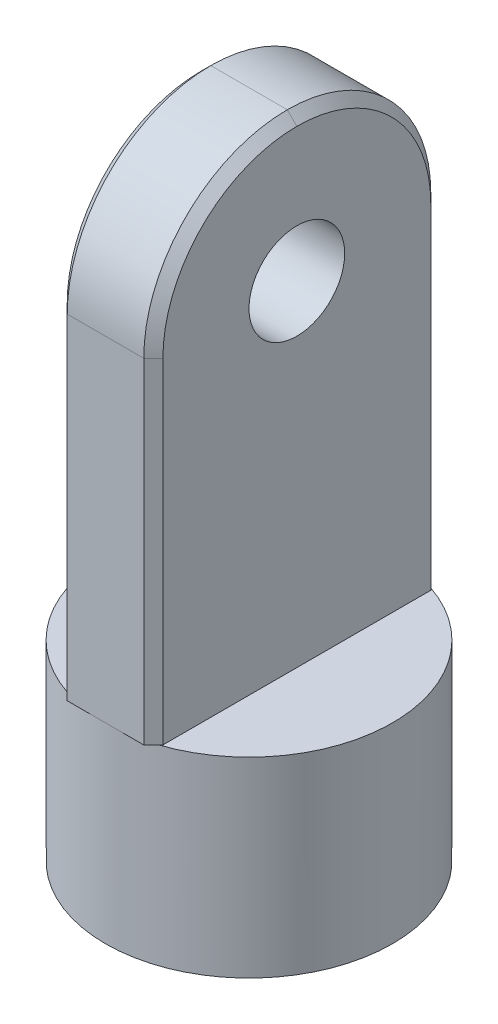
ISO-10303-21;
HEADER;
FILE_DESCRIPTION(('STEP AP214'),'2;1');
FILE_NAME('part.step','',(''),(''),'','','');
FILE_SCHEMA(('AUTOMOTIVE_DESIGN { 1 0 10303 214 1 1 1 1 }'));
ENDSEC;
DATA;
#1=APPLICATION_CONTEXT('core data for automotive mechanical design processes');
#2=APPLICATION_PROTOCOL_DEFINITION('international standard','automotive_design',2000,#1);
#3=PRODUCT_CONTEXT('',#1,'mechanical');
#4=PRODUCT('Part','Part','',(#3));
#5=PRODUCT_RELATED_PRODUCT_CATEGORY('part','',(#4));
#6=PRODUCT_DEFINITION_FORMATION('','',#4);
#7=PRODUCT_DEFINITION_CONTEXT('part definition',#1,'design');
#8=PRODUCT_DEFINITION('design','',#6,#7);
#9=PRODUCT_DEFINITION_SHAPE('','',#8);
#10=(LENGTH_UNIT() NAMED_UNIT(*) SI_UNIT(.MILLI.,.METRE.));
#11=(NAMED_UNIT(*) PLANE_ANGLE_UNIT() SI_UNIT($,.RADIAN.));
#12=(NAMED_UNIT(*) SI_UNIT($,.STERADIAN.) SOLID_ANGLE_UNIT());
#13=UNCERTAINTY_MEASURE_WITH_UNIT(LENGTH_MEASURE(1.E-05),#10,'distance_accuracy_value','');
#14=(GEOMETRIC_REPRESENTATION_CONTEXT(3) GLOBAL_UNCERTAINTY_ASSIGNED_CONTEXT((#13)) GLOBAL_UNIT_ASSIGNED_CONTEXT((#10,
#11,#12)) REPRESENTATION_CONTEXT('',''));
#15=CARTESIAN_POINT('',(0.,0.,0.));
#16=DIRECTION('',(0.,0.,1.));
#17=DIRECTION('',(1.,0.,0.));
#18=AXIS2_PLACEMENT_3D('',#15,#16,#17);
#19=CARTESIAN_POINT('',(0.,10.,0.));
#20=DIRECTION('',(0.,1.,0.));
#21=DIRECTION('',(0.,0.,1.));
#22=AXIS2_PLACEMENT_3D('',#19,#20,#21);
#23=PLANE('',#22);
#24=DIRECTION('',(0.,0.,-1.));
#25=VECTOR('',#24,1.);
#26=CARTESIAN_POINT('',(2.5,10.,7.5));
#27=LINE('',#26,#25);
#28=CARTESIAN_POINT('',(2.5,10.,7.));
#29=VERTEX_POINT('',#28);
#30=CARTESIAN_POINT('',(2.5,10.,-7.));
#31=VERTEX_POINT('',#30);
#32=EDGE_CURVE('E177',#29,#31,#27,.T.);
#33=ORIENTED_EDGE('',*,*,#32,.F.);
#34=DIRECTION('',(0.70710678118655,0.,-0.707106781186545));
#35=VECTOR('',#34,1.);
#36=CARTESIAN_POINT('',(2.5,10.,7.));
#37=LINE('',#36,#35);
#38=CARTESIAN_POINT('',(2.39150471698585,10.,7.10849528301415));
#39=VERTEX_POINT('',#38);
#40=EDGE_CURVE('E226',#29,#39,#37,.F.);
#41=ORIENTED_EDGE('',*,*,#40,.T.);
#42=CARTESIAN_POINT('',(0.,10.,0.));
#43=DIRECTION('',(0.,1.,0.));
#44=DIRECTION('',(0.,0.,1.));
#45=AXIS2_PLACEMENT_3D('',#42,#43,#44);
#46=CIRCLE('',#45,7.5);
#47=CARTESIAN_POINT('',(2.39150471698585,10.,-7.10849528301415));
#48=VERTEX_POINT('',#47);
#49=EDGE_CURVE('E153',#39,#48,#46,.T.);
#50=ORIENTED_EDGE('',*,*,#49,.T.);
#51=DIRECTION('',(-0.707106781186549,0.,-0.707106781186546));
#52=VECTOR('',#51,1.);
#53=CARTESIAN_POINT('',(2.,10.,-7.5));
#54=LINE('',#53,#52);
#55=EDGE_CURVE('E224',#48,#31,#54,.F.);
#56=ORIENTED_EDGE('',*,*,#55,.T.);
#57=EDGE_LOOP('',(#33,#41,#50,#56));
#58=FACE_BOUND('',#57,.T.);
#59=ADVANCED_FACE('F33',(#58),#23,.T.);
#60=CARTESIAN_POINT('',(0.,10.,0.));
#61=DIRECTION('',(0.,-1.,0.));
#62=DIRECTION('',(0.,0.,-1.));
#63=AXIS2_PLACEMENT_3D('',#60,#61,#62);
#64=CYLINDRICAL_SURFACE('',#63,7.5);
#65=CARTESIAN_POINT('',(0.,10.,7.5));
#66=VERTEX_POINT('',#65);
#67=EDGE_CURVE('E137',#66,#39,#46,.T.);
#68=ORIENTED_EDGE('',*,*,#67,.F.);
#69=CARTESIAN_POINT('',(-2.39150471698584,10.,7.10849528301415));
#70=VERTEX_POINT('',#69);
#71=EDGE_CURVE('E126',#70,#66,#46,.T.);
#72=ORIENTED_EDGE('',*,*,#71,.F.);
#73=CARTESIAN_POINT('',(-2.39150471698583,10.,-7.10849528301416));
#74=VERTEX_POINT('',#73);
#75=EDGE_CURVE('E51',#74,#70,#46,.T.);
#76=ORIENTED_EDGE('',*,*,#75,.F.);
#77=CARTESIAN_POINT('',(0.,10.,-7.5));
#78=VERTEX_POINT('',#77);
#79=EDGE_CURVE('E308',#78,#74,#46,.T.);
#80=ORIENTED_EDGE('',*,*,#79,.F.);
#81=EDGE_CURVE('E136',#48,#78,#46,.T.);
#82=ORIENTED_EDGE('',*,*,#81,.F.);
#83=ORIENTED_EDGE('',*,*,#49,.F.);
#84=EDGE_LOOP('',(#68,#72,#76,#80,#82,#83));
#85=FACE_BOUND('',#84,.T.);
#86=CARTESIAN_POINT('',(0.,0.,0.));
#87=DIRECTION('',(0.,1.,0.));
#88=DIRECTION('',(0.,0.,1.));
#89=AXIS2_PLACEMENT_3D('',#86,#87,#88);
#90=CIRCLE('',#89,7.5);
#91=CARTESIAN_POINT('',(0.,0.,7.5));
#92=VERTEX_POINT('',#91);
#93=EDGE_CURVE('E134',#92,#92,#90,.T.);
#94=ORIENTED_EDGE('',*,*,#93,.T.);
#95=EDGE_LOOP('',(#94));
#96=FACE_BOUND('',#95,.T.);
#97=ADVANCED_FACE('F150',(#85,#96),#64,.T.);
#98=DIRECTION('',(0.,0.,1.));
#99=VECTOR('',#98,1.);
#100=CARTESIAN_POINT('',(-2.5,10.,7.5));
#101=LINE('',#100,#99);
#102=CARTESIAN_POINT('',(-2.5,10.,-6.99999999999999));
#103=VERTEX_POINT('',#102);
#104=CARTESIAN_POINT('',(-2.5,10.,6.99999999999999));
#105=VERTEX_POINT('',#104);
#106=EDGE_CURVE('E156',#103,#105,#101,.T.);
#107=ORIENTED_EDGE('',*,*,#106,.F.);
#108=DIRECTION('',(-0.707106781186544,0.,0.707106781186551));
#109=VECTOR('',#108,1.);
#110=CARTESIAN_POINT('',(-2.5,10.,-6.99999999999999));
#111=LINE('',#110,#109);
#112=EDGE_CURVE('E43',#103,#74,#111,.F.);
#113=ORIENTED_EDGE('',*,*,#112,.T.);
#114=ORIENTED_EDGE('',*,*,#75,.T.);
#115=DIRECTION('',(0.707106781186545,0.,0.70710678118655));
#116=VECTOR('',#115,1.);
#117=CARTESIAN_POINT('',(-1.99999999999999,10.,7.5));
#118=LINE('',#117,#116);
#119=EDGE_CURVE('E11',#70,#105,#118,.F.);
#120=ORIENTED_EDGE('',*,*,#119,.T.);
#121=EDGE_LOOP('',(#107,#113,#114,#120));
#122=FACE_BOUND('',#121,.T.);
#123=ADVANCED_FACE('F257',(#122),#23,.T.);
#124=CARTESIAN_POINT('',(0.,0.,0.));
#125=DIRECTION('',(0.,1.,0.));
#126=DIRECTION('',(0.,0.,1.));
#127=AXIS2_PLACEMENT_3D('',#124,#125,#126);
#128=PLANE('',#127);
#129=CARTESIAN_POINT('',(0.,0.,0.));
#130=DIRECTION('',(0.,-1.,0.));
#131=DIRECTION('',(0.,0.,-1.));
#132=AXIS2_PLACEMENT_3D('',#129,#130,#131);
#133=CIRCLE('',#132,6.25);
#134=CARTESIAN_POINT('',(0.,0.,-6.25));
#135=VERTEX_POINT('',#134);
#136=EDGE_CURVE('E147',#135,#135,#133,.T.);
#137=ORIENTED_EDGE('',*,*,#136,.F.);
#138=EDGE_LOOP('',(#137));
#139=FACE_BOUND('',#138,.T.);
#140=ORIENTED_EDGE('',*,*,#93,.F.);
#141=EDGE_LOOP('',(#140));
#142=FACE_BOUND('',#141,.T.);
#143=ADVANCED_FACE('F330',(#139,#142),#128,.F.);
#144=CARTESIAN_POINT('',(0.,7.5,0.));
#145=DIRECTION('',(0.,-1.,0.));
#146=DIRECTION('',(0.,0.,-1.));
#147=AXIS2_PLACEMENT_3D('',#144,#145,#146);
#148=CYLINDRICAL_SURFACE('',#147,6.25);
#149=CARTESIAN_POINT('',(0.,7.5,0.));
#150=DIRECTION('',(0.,-1.,0.));
#151=DIRECTION('',(0.,0.,-1.));
#152=AXIS2_PLACEMENT_3D('',#149,#150,#151);
#153=CIRCLE('',#152,6.25);
#154=CARTESIAN_POINT('',(0.,7.5,-6.25));
#155=VERTEX_POINT('',#154);
#156=EDGE_CURVE('E166',#155,#155,#153,.T.);
#157=ORIENTED_EDGE('',*,*,#156,.F.);
#158=EDGE_LOOP('',(#157));
#159=FACE_BOUND('',#158,.T.);
#160=ORIENTED_EDGE('',*,*,#136,.T.);
#161=EDGE_LOOP('',(#160));
#162=FACE_BOUND('',#161,.T.);
#163=ADVANCED_FACE('F334',(#159,#162),#148,.F.);
#164=CARTESIAN_POINT('',(0.,7.5,0.));
#165=DIRECTION('',(0.,-1.,0.));
#166=DIRECTION('',(0.,0.,-1.));
#167=AXIS2_PLACEMENT_3D('',#164,#165,#166);
#168=PLANE('',#167);
#169=ORIENTED_EDGE('',*,*,#156,.T.);
#170=EDGE_LOOP('',(#169));
#171=FACE_BOUND('',#170,.T.);
#172=ADVANCED_FACE('F317',(#171),#168,.T.);
#173=CARTESIAN_POINT('',(0.,10.,0.));
#174=DIRECTION('',(0.,-1.,0.));
#175=DIRECTION('',(0.,0.,-1.));
#176=AXIS2_PLACEMENT_3D('',#173,#174,#175);
#177=PLANE('',#176);
#178=DIRECTION('',(-1.,0.,0.));
#179=VECTOR('',#178,1.);
#180=CARTESIAN_POINT('',(-2.5,10.,-7.5));
#181=LINE('',#180,#179);
#182=CARTESIAN_POINT('',(2.,10.,-7.5));
#183=VERTEX_POINT('',#182);
#184=EDGE_CURVE('E160',#183,#78,#181,.T.);
#185=ORIENTED_EDGE('',*,*,#184,.F.);
#186=DIRECTION('',(-0.707106781186549,0.,-0.707106781186546));
#187=VECTOR('',#186,1.);
#188=CARTESIAN_POINT('',(4.74999999999999,10.,-4.75000000000002));
#189=LINE('',#188,#187);
#190=EDGE_CURVE('E189',#183,#48,#189,.F.);
#191=ORIENTED_EDGE('',*,*,#190,.T.);
#192=ORIENTED_EDGE('',*,*,#81,.T.);
#193=EDGE_LOOP('',(#185,#191,#192));
#194=FACE_BOUND('',#193,.T.);
#195=ADVANCED_FACE('F306',(#194),#177,.T.);
#196=ORIENTED_EDGE('',*,*,#79,.T.);
#197=DIRECTION('',(-0.707106781186544,0.,0.707106781186551));
#198=VECTOR('',#197,1.);
#199=CARTESIAN_POINT('',(-4.75000000000001,10.,-4.74999999999996));
#200=LINE('',#199,#198);
#201=CARTESIAN_POINT('',(-1.99999999999999,10.,-7.5));
#202=VERTEX_POINT('',#201);
#203=EDGE_CURVE('E221',#74,#202,#200,.F.);
#204=ORIENTED_EDGE('',*,*,#203,.T.);
#205=EDGE_CURVE('E162',#78,#202,#181,.T.);
#206=ORIENTED_EDGE('',*,*,#205,.F.);
#207=EDGE_LOOP('',(#196,#204,#206));
#208=FACE_BOUND('',#207,.T.);
#209=ADVANCED_FACE('F309',(#208),#177,.T.);
#210=ORIENTED_EDGE('',*,*,#67,.T.);
#211=DIRECTION('',(0.70710678118655,0.,-0.707106781186545));
#212=VECTOR('',#211,1.);
#213=CARTESIAN_POINT('',(4.74999999999999,10.,4.75000000000002));
#214=LINE('',#213,#212);
#215=CARTESIAN_POINT('',(2.,10.,7.5));
#216=VERTEX_POINT('',#215);
#217=EDGE_CURVE('E159',#39,#216,#214,.F.);
#218=ORIENTED_EDGE('',*,*,#217,.T.);
#219=DIRECTION('',(1.,0.,0.));
#220=VECTOR('',#219,1.);
#221=CARTESIAN_POINT('',(-2.5,10.,7.5));
#222=LINE('',#221,#220);
#223=EDGE_CURVE('E142',#66,#216,#222,.T.);
#224=ORIENTED_EDGE('',*,*,#223,.F.);
#225=EDGE_LOOP('',(#210,#218,#224));
#226=FACE_BOUND('',#225,.T.);
#227=ADVANCED_FACE('F157',(#226),#177,.T.);
#228=CARTESIAN_POINT('',(2.5,35.,7.5));
#229=DIRECTION('',(-1.,0.,0.));
#230=DIRECTION('',(0.,0.,1.));
#231=AXIS2_PLACEMENT_3D('',#228,#229,#230);
#232=PLANE('',#231);
#233=CARTESIAN_POINT('',(2.5,27.5,0.));
#234=DIRECTION('',(1.,0.,0.));
#235=DIRECTION('',(0.,0.,-1.));
#236=AXIS2_PLACEMENT_3D('',#233,#234,#235);
#237=CIRCLE('',#236,2.5);
#238=CARTESIAN_POINT('',(2.5,27.5,-2.5));
#239=VERTEX_POINT('',#238);
#240=EDGE_CURVE('E183',#239,#239,#237,.T.);
#241=ORIENTED_EDGE('',*,*,#240,.F.);
#242=EDGE_LOOP('',(#241));
#243=FACE_BOUND('',#242,.T.);
#244=ORIENTED_EDGE('',*,*,#32,.T.);
#245=DIRECTION('',(0.,1.,0.));
#246=VECTOR('',#245,1.);
#247=CARTESIAN_POINT('',(2.5,35.,-7.));
#248=LINE('',#247,#246);
#249=CARTESIAN_POINT('',(2.5,27.5,-7.));
#250=VERTEX_POINT('',#249);
#251=EDGE_CURVE('E198',#31,#250,#248,.T.);
#252=ORIENTED_EDGE('',*,*,#251,.T.);
#253=CARTESIAN_POINT('',(2.5,27.5,0.));
#254=DIRECTION('',(-1.,0.,0.));
#255=DIRECTION('',(0.,0.,1.));
#256=AXIS2_PLACEMENT_3D('',#253,#254,#255);
#257=CIRCLE('',#256,7.);
#258=CARTESIAN_POINT('',(2.5,34.5,0.));
#259=VERTEX_POINT('',#258);
#260=EDGE_CURVE('E196',#250,#259,#257,.F.);
#261=ORIENTED_EDGE('',*,*,#260,.T.);
#262=CARTESIAN_POINT('',(2.5,27.5,0.));
#263=DIRECTION('',(-1.,0.,0.));
#264=DIRECTION('',(0.,0.,1.));
#265=AXIS2_PLACEMENT_3D('',#262,#263,#264);
#266=CIRCLE('',#265,7.);
#267=CARTESIAN_POINT('',(2.5,27.5,7.));
#268=VERTEX_POINT('',#267);
#269=EDGE_CURVE('E194',#259,#268,#266,.F.);
#270=ORIENTED_EDGE('',*,*,#269,.T.);
#271=DIRECTION('',(0.,-1.,0.));
#272=VECTOR('',#271,1.);
#273=CARTESIAN_POINT('',(2.5,35.,7.));
#274=LINE('',#273,#272);
#275=EDGE_CURVE('E192',#268,#29,#274,.T.);
#276=ORIENTED_EDGE('',*,*,#275,.T.);
#277=EDGE_LOOP('',(#244,#252,#261,#270,#276));
#278=FACE_BOUND('',#277,.T.);
#279=ADVANCED_FACE('F316',(#243,#278),#232,.F.);
#280=CARTESIAN_POINT('',(-2.5,35.,-7.5));
#281=DIRECTION('',(0.,0.,1.));
#282=DIRECTION('',(1.,0.,0.));
#283=AXIS2_PLACEMENT_3D('',#280,#281,#282);
#284=PLANE('',#283);
#285=DIRECTION('',(-1.,0.,0.));
#286=VECTOR('',#285,1.);
#287=CARTESIAN_POINT('',(-2.5,27.5,-7.5));
#288=LINE('',#287,#286);
#289=CARTESIAN_POINT('',(-1.99999999999999,27.5,-7.5));
#290=VERTEX_POINT('',#289);
#291=CARTESIAN_POINT('',(2.,27.5,-7.5));
#292=VERTEX_POINT('',#291);
#293=EDGE_CURVE('E173',#290,#292,#288,.F.);
#294=ORIENTED_EDGE('',*,*,#293,.T.);
#295=DIRECTION('',(0.,-1.,0.));
#296=VECTOR('',#295,1.);
#297=CARTESIAN_POINT('',(2.,35.,-7.5));
#298=LINE('',#297,#296);
#299=EDGE_CURVE('E186',#292,#183,#298,.T.);
#300=ORIENTED_EDGE('',*,*,#299,.T.);
#301=ORIENTED_EDGE('',*,*,#184,.T.);
#302=ORIENTED_EDGE('',*,*,#205,.T.);
#303=DIRECTION('',(0.,1.,0.));
#304=VECTOR('',#303,1.);
#305=CARTESIAN_POINT('',(-1.99999999999999,35.,-7.5));
#306=LINE('',#305,#304);
#307=EDGE_CURVE('E179',#202,#290,#306,.T.);
#308=ORIENTED_EDGE('',*,*,#307,.T.);
#309=EDGE_LOOP('',(#294,#300,#301,#302,#308));
#310=FACE_BOUND('',#309,.T.);
#311=ADVANCED_FACE('F277',(#310),#284,.F.);
#312=CARTESIAN_POINT('',(-2.5,35.,7.5));
#313=DIRECTION('',(1.,0.,0.));
#314=DIRECTION('',(0.,0.,-1.));
#315=AXIS2_PLACEMENT_3D('',#312,#313,#314);
#316=PLANE('',#315);
#317=CARTESIAN_POINT('',(-2.5,27.5,0.));
#318=DIRECTION('',(1.,0.,0.));
#319=DIRECTION('',(0.,0.,-1.));
#320=AXIS2_PLACEMENT_3D('',#317,#318,#319);
#321=CIRCLE('',#320,2.5);
#322=CARTESIAN_POINT('',(-2.5,27.5,-2.5));
#323=VERTEX_POINT('',#322);
#324=EDGE_CURVE('E269',#323,#323,#321,.T.);
#325=ORIENTED_EDGE('',*,*,#324,.T.);
#326=EDGE_LOOP('',(#325));
#327=FACE_BOUND('',#326,.T.);
#328=CARTESIAN_POINT('',(-2.5,27.5,0.));
#329=DIRECTION('',(1.,0.,0.));
#330=DIRECTION('',(0.,0.,-1.));
#331=AXIS2_PLACEMENT_3D('',#328,#329,#330);
#332=CIRCLE('',#331,6.99999999999999);
#333=CARTESIAN_POINT('',(-2.5,34.5,0.));
#334=VERTEX_POINT('',#333);
#335=CARTESIAN_POINT('',(-2.5,27.5,-6.99999999999999));
#336=VERTEX_POINT('',#335);
#337=EDGE_CURVE('E216',#334,#336,#332,.F.);
#338=ORIENTED_EDGE('',*,*,#337,.T.);
#339=DIRECTION('',(0.,-1.,0.));
#340=VECTOR('',#339,1.);
#341=CARTESIAN_POINT('',(-2.5,35.,-6.99999999999999));
#342=LINE('',#341,#340);
#343=EDGE_CURVE('E218',#336,#103,#342,.T.);
#344=ORIENTED_EDGE('',*,*,#343,.T.);
#345=ORIENTED_EDGE('',*,*,#106,.T.);
#346=DIRECTION('',(0.,1.,0.));
#347=VECTOR('',#346,1.);
#348=CARTESIAN_POINT('',(-2.5,35.,6.99999999999999));
#349=LINE('',#348,#347);
#350=CARTESIAN_POINT('',(-2.5,27.5,6.99999999999999));
#351=VERTEX_POINT('',#350);
#352=EDGE_CURVE('E212',#105,#351,#349,.T.);
#353=ORIENTED_EDGE('',*,*,#352,.T.);
#354=CARTESIAN_POINT('',(-2.5,27.5,0.));
#355=DIRECTION('',(1.,0.,0.));
#356=DIRECTION('',(0.,0.,-1.));
#357=AXIS2_PLACEMENT_3D('',#354,#355,#356);
#358=CIRCLE('',#357,6.99999999999999);
#359=EDGE_CURVE('E214',#351,#334,#358,.F.);
#360=ORIENTED_EDGE('',*,*,#359,.T.);
#361=EDGE_LOOP('',(#338,#344,#345,#353,#360));
#362=FACE_BOUND('',#361,.T.);
#363=ADVANCED_FACE('F259',(#327,#362),#316,.F.);
#364=CARTESIAN_POINT('',(-2.5,35.,7.5));
#365=DIRECTION('',(0.,0.,-1.));
#366=DIRECTION('',(-1.,0.,0.));
#367=AXIS2_PLACEMENT_3D('',#364,#365,#366);
#368=PLANE('',#367);
#369=ORIENTED_EDGE('',*,*,#223,.T.);
#370=DIRECTION('',(0.,1.,0.));
#371=VECTOR('',#370,1.);
#372=CARTESIAN_POINT('',(2.,35.,7.5));
#373=LINE('',#372,#371);
#374=CARTESIAN_POINT('',(2.,27.5,7.5));
#375=VERTEX_POINT('',#374);
#376=EDGE_CURVE('E210',#216,#375,#373,.T.);
#377=ORIENTED_EDGE('',*,*,#376,.T.);
#378=DIRECTION('',(1.,0.,0.));
#379=VECTOR('',#378,1.);
#380=CARTESIAN_POINT('',(-2.5,27.5,7.5));
#381=LINE('',#380,#379);
#382=CARTESIAN_POINT('',(-1.99999999999999,27.5,7.5));
#383=VERTEX_POINT('',#382);
#384=EDGE_CURVE('E176',#375,#383,#381,.F.);
#385=ORIENTED_EDGE('',*,*,#384,.T.);
#386=DIRECTION('',(0.,-1.,0.));
#387=VECTOR('',#386,1.);
#388=CARTESIAN_POINT('',(-1.99999999999999,35.,7.5));
#389=LINE('',#388,#387);
#390=CARTESIAN_POINT('',(-1.99999999999999,10.,7.5));
#391=VERTEX_POINT('',#390);
#392=EDGE_CURVE('E146',#383,#391,#389,.T.);
#393=ORIENTED_EDGE('',*,*,#392,.T.);
#394=EDGE_CURVE('E129',#391,#66,#222,.T.);
#395=ORIENTED_EDGE('',*,*,#394,.T.);
#396=EDGE_LOOP('',(#369,#377,#385,#393,#395));
#397=FACE_BOUND('',#396,.T.);
#398=ADVANCED_FACE('F140',(#397),#368,.F.);
#399=ORIENTED_EDGE('',*,*,#394,.F.);
#400=DIRECTION('',(0.707106781186545,0.,0.70710678118655));
#401=VECTOR('',#400,1.);
#402=CARTESIAN_POINT('',(-4.75,10.,4.74999999999997));
#403=LINE('',#402,#401);
#404=EDGE_CURVE('E131',#391,#70,#403,.F.);
#405=ORIENTED_EDGE('',*,*,#404,.T.);
#406=ORIENTED_EDGE('',*,*,#71,.T.);
#407=EDGE_LOOP('',(#399,#405,#406));
#408=FACE_BOUND('',#407,.T.);
#409=ADVANCED_FACE('F128',(#408),#177,.T.);
#410=CARTESIAN_POINT('',(-2.5,27.5,0.));
#411=DIRECTION('',(1.,0.,0.));
#412=DIRECTION('',(0.,0.,-1.));
#413=AXIS2_PLACEMENT_3D('',#410,#411,#412);
#414=CYLINDRICAL_SURFACE('',#413,2.5);
#415=ORIENTED_EDGE('',*,*,#324,.F.);
#416=EDGE_LOOP('',(#415));
#417=FACE_BOUND('',#416,.T.);
#418=ORIENTED_EDGE('',*,*,#240,.T.);
#419=EDGE_LOOP('',(#418));
#420=FACE_BOUND('',#419,.T.);
#421=ADVANCED_FACE('F348',(#417,#420),#414,.F.);
#422=CARTESIAN_POINT('',(0.,27.5,0.));
#423=DIRECTION('',(1.,0.,0.));
#424=DIRECTION('',(0.,0.,-1.));
#425=AXIS2_PLACEMENT_3D('',#422,#423,#424);
#426=CYLINDRICAL_SURFACE('',#425,7.5);
#427=ORIENTED_EDGE('',*,*,#384,.F.);
#428=CARTESIAN_POINT('',(2.,27.5,0.));
#429=DIRECTION('',(-1.,0.,0.));
#430=DIRECTION('',(0.,0.,1.));
#431=AXIS2_PLACEMENT_3D('',#428,#429,#430);
#432=CIRCLE('',#431,7.5);
#433=CARTESIAN_POINT('',(2.,35.,0.));
#434=VERTEX_POINT('',#433);
#435=EDGE_CURVE('E206',#375,#434,#432,.T.);
#436=ORIENTED_EDGE('',*,*,#435,.T.);
#437=DIRECTION('',(1.,0.,0.));
#438=VECTOR('',#437,1.);
#439=CARTESIAN_POINT('',(0.,35.,0.));
#440=LINE('',#439,#438);
#441=CARTESIAN_POINT('',(-1.99999999999999,35.,0.));
#442=VERTEX_POINT('',#441);
#443=EDGE_CURVE('E180',#442,#434,#440,.T.);
#444=ORIENTED_EDGE('',*,*,#443,.F.);
#445=CARTESIAN_POINT('',(-1.99999999999999,27.5,0.));
#446=DIRECTION('',(1.,0.,0.));
#447=DIRECTION('',(0.,0.,-1.));
#448=AXIS2_PLACEMENT_3D('',#445,#446,#447);
#449=CIRCLE('',#448,7.5);
#450=EDGE_CURVE('E204',#442,#383,#449,.T.);
#451=ORIENTED_EDGE('',*,*,#450,.T.);
#452=EDGE_LOOP('',(#427,#436,#444,#451));
#453=FACE_BOUND('',#452,.T.);
#454=ADVANCED_FACE('F292',(#453),#426,.T.);
#455=CARTESIAN_POINT('',(0.,27.5,0.));
#456=DIRECTION('',(-1.,0.,0.));
#457=DIRECTION('',(0.,0.,1.));
#458=AXIS2_PLACEMENT_3D('',#455,#456,#457);
#459=CYLINDRICAL_SURFACE('',#458,7.5);
#460=ORIENTED_EDGE('',*,*,#443,.T.);
#461=CARTESIAN_POINT('',(2.,27.5,0.));
#462=DIRECTION('',(-1.,0.,0.));
#463=DIRECTION('',(0.,0.,1.));
#464=AXIS2_PLACEMENT_3D('',#461,#462,#463);
#465=CIRCLE('',#464,7.5);
#466=EDGE_CURVE('E202',#434,#292,#465,.T.);
#467=ORIENTED_EDGE('',*,*,#466,.T.);
#468=ORIENTED_EDGE('',*,*,#293,.F.);
#469=CARTESIAN_POINT('',(-1.99999999999999,27.5,0.));
#470=DIRECTION('',(1.,0.,0.));
#471=DIRECTION('',(0.,0.,-1.));
#472=AXIS2_PLACEMENT_3D('',#469,#470,#471);
#473=CIRCLE('',#472,7.5);
#474=EDGE_CURVE('E200',#290,#442,#473,.T.);
#475=ORIENTED_EDGE('',*,*,#474,.T.);
#476=EDGE_LOOP('',(#460,#467,#468,#475));
#477=FACE_BOUND('',#476,.T.);
#478=ADVANCED_FACE('F288',(#477),#459,.T.);
#479=CARTESIAN_POINT('',(2.5,35.,7.));
#480=DIRECTION('',(-0.707106781186545,0.,-0.70710678118655));
#481=DIRECTION('',(0.,-1.,0.));
#482=AXIS2_PLACEMENT_3D('',#479,#480,#481);
#483=PLANE('',#482);
#484=ORIENTED_EDGE('',*,*,#40,.F.);
#485=ORIENTED_EDGE('',*,*,#275,.F.);
#486=DIRECTION('',(0.70710678118655,0.,-0.707106781186545));
#487=VECTOR('',#486,1.);
#488=CARTESIAN_POINT('',(2.,27.5,7.5));
#489=LINE('',#488,#487);
#490=EDGE_CURVE('E184',#375,#268,#489,.T.);
#491=ORIENTED_EDGE('',*,*,#490,.F.);
#492=ORIENTED_EDGE('',*,*,#376,.F.);
#493=ORIENTED_EDGE('',*,*,#217,.F.);
#494=EDGE_LOOP('',(#484,#485,#491,#492,#493));
#495=FACE_BOUND('',#494,.T.);
#496=ADVANCED_FACE('F345',(#495),#483,.F.);
#497=CARTESIAN_POINT('',(2.5,27.5,0.));
#498=DIRECTION('',(-1.,0.,0.));
#499=DIRECTION('',(0.,0.,1.));
#500=AXIS2_PLACEMENT_3D('',#497,#498,#499);
#501=CONICAL_SURFACE('',#500,7.,0.785398163397445);
#502=ORIENTED_EDGE('',*,*,#490,.T.);
#503=ORIENTED_EDGE('',*,*,#269,.F.);
#504=DIRECTION('',(0.707106781186547,-0.707106781186547,0.));
#505=VECTOR('',#504,1.);
#506=CARTESIAN_POINT('',(2.,35.,0.));
#507=LINE('',#506,#505);
#508=EDGE_CURVE('E233',#434,#259,#507,.T.);
#509=ORIENTED_EDGE('',*,*,#508,.F.);
#510=ORIENTED_EDGE('',*,*,#435,.F.);
#511=EDGE_LOOP('',(#502,#503,#509,#510));
#512=FACE_BOUND('',#511,.T.);
#513=ADVANCED_FACE('F296',(#512),#501,.T.);
#514=CARTESIAN_POINT('',(2.5,27.5,0.));
#515=DIRECTION('',(-1.,0.,0.));
#516=DIRECTION('',(0.,0.,1.));
#517=AXIS2_PLACEMENT_3D('',#514,#515,#516);
#518=CONICAL_SURFACE('',#517,7.,0.785398163397448);
#519=ORIENTED_EDGE('',*,*,#508,.T.);
#520=ORIENTED_EDGE('',*,*,#260,.F.);
#521=DIRECTION('',(0.707106781186547,0.,0.707106781186547));
#522=VECTOR('',#521,1.);
#523=CARTESIAN_POINT('',(2.,27.5,-7.5));
#524=LINE('',#523,#522);
#525=EDGE_CURVE('E230',#292,#250,#524,.T.);
#526=ORIENTED_EDGE('',*,*,#525,.F.);
#527=ORIENTED_EDGE('',*,*,#466,.F.);
#528=EDGE_LOOP('',(#519,#520,#526,#527));
#529=FACE_BOUND('',#528,.T.);
#530=ADVANCED_FACE('F302',(#529),#518,.T.);
#531=CARTESIAN_POINT('',(2.,35.,-7.5));
#532=DIRECTION('',(-0.707106781186546,0.,0.707106781186549));
#533=DIRECTION('',(0.,-1.,0.));
#534=AXIS2_PLACEMENT_3D('',#531,#532,#533);
#535=PLANE('',#534);
#536=ORIENTED_EDGE('',*,*,#525,.T.);
#537=ORIENTED_EDGE('',*,*,#251,.F.);
#538=ORIENTED_EDGE('',*,*,#55,.F.);
#539=ORIENTED_EDGE('',*,*,#190,.F.);
#540=ORIENTED_EDGE('',*,*,#299,.F.);
#541=EDGE_LOOP('',(#536,#537,#538,#539,#540));
#542=FACE_BOUND('',#541,.T.);
#543=ADVANCED_FACE('F349',(#542),#535,.F.);
#544=CARTESIAN_POINT('',(-1.99999999999999,35.,7.5));
#545=DIRECTION('',(0.70710678118655,0.,-0.707106781186545));
#546=DIRECTION('',(0.,-1.,0.));
#547=AXIS2_PLACEMENT_3D('',#544,#545,#546);
#548=PLANE('',#547);
#549=ORIENTED_EDGE('',*,*,#404,.F.);
#550=ORIENTED_EDGE('',*,*,#392,.F.);
#551=DIRECTION('',(0.707106781186545,0.,0.70710678118655));
#552=VECTOR('',#551,1.);
#553=CARTESIAN_POINT('',(-2.5,27.5,6.99999999999999));
#554=LINE('',#553,#552);
#555=EDGE_CURVE('E37',#351,#383,#554,.T.);
#556=ORIENTED_EDGE('',*,*,#555,.F.);
#557=ORIENTED_EDGE('',*,*,#352,.F.);
#558=ORIENTED_EDGE('',*,*,#119,.F.);
#559=EDGE_LOOP('',(#549,#550,#556,#557,#558));
#560=FACE_BOUND('',#559,.T.);
#561=ADVANCED_FACE('F35',(#560),#548,.F.);
#562=CARTESIAN_POINT('',(-2.5,27.5,0.));
#563=DIRECTION('',(1.,0.,0.));
#564=DIRECTION('',(0.,0.,-1.));
#565=AXIS2_PLACEMENT_3D('',#562,#563,#564);
#566=CONICAL_SURFACE('',#565,6.99999999999999,0.785398163397455);
#567=ORIENTED_EDGE('',*,*,#555,.T.);
#568=ORIENTED_EDGE('',*,*,#450,.F.);
#569=DIRECTION('',(0.707106781186543,0.707106781186552,0.));
#570=VECTOR('',#569,1.);
#571=CARTESIAN_POINT('',(-2.5,34.5,0.));
#572=LINE('',#571,#570);
#573=EDGE_CURVE('E240',#334,#442,#572,.T.);
#574=ORIENTED_EDGE('',*,*,#573,.F.);
#575=ORIENTED_EDGE('',*,*,#359,.F.);
#576=EDGE_LOOP('',(#567,#568,#574,#575));
#577=FACE_BOUND('',#576,.T.);
#578=ADVANCED_FACE('F251',(#577),#566,.T.);
#579=CARTESIAN_POINT('',(-2.5,27.5,0.));
#580=DIRECTION('',(1.,0.,0.));
#581=DIRECTION('',(0.,0.,-1.));
#582=AXIS2_PLACEMENT_3D('',#579,#580,#581);
#583=CONICAL_SURFACE('',#582,6.99999999999999,0.785398163397452);
#584=ORIENTED_EDGE('',*,*,#573,.T.);
#585=ORIENTED_EDGE('',*,*,#474,.F.);
#586=DIRECTION('',(0.707106781186545,0.,-0.70710678118655));
#587=VECTOR('',#586,1.);
#588=CARTESIAN_POINT('',(-2.5,27.5,-6.99999999999999));
#589=LINE('',#588,#587);
#590=EDGE_CURVE('E238',#336,#290,#589,.T.);
#591=ORIENTED_EDGE('',*,*,#590,.F.);
#592=ORIENTED_EDGE('',*,*,#337,.F.);
#593=EDGE_LOOP('',(#584,#585,#591,#592));
#594=FACE_BOUND('',#593,.T.);
#595=ADVANCED_FACE('F285',(#594),#583,.T.);
#596=CARTESIAN_POINT('',(-2.5,35.,-6.99999999999999));
#597=DIRECTION('',(0.707106781186551,0.,0.707106781186544));
#598=DIRECTION('',(0.,-1.,0.));
#599=AXIS2_PLACEMENT_3D('',#596,#597,#598);
#600=PLANE('',#599);
#601=ORIENTED_EDGE('',*,*,#590,.T.);
#602=ORIENTED_EDGE('',*,*,#307,.F.);
#603=ORIENTED_EDGE('',*,*,#203,.F.);
#604=ORIENTED_EDGE('',*,*,#112,.F.);
#605=ORIENTED_EDGE('',*,*,#343,.F.);
#606=EDGE_LOOP('',(#601,#602,#603,#604,#605));
#607=FACE_BOUND('',#606,.T.);
#608=ADVANCED_FACE('F283',(#607),#600,.F.);
#609=CLOSED_SHELL('',(#59,#97,#123,#143,#163,#172,#195,#209,#227,#279,#311,#363,#398,#409,#421,
#454,#478,#496,#513,#530,#543,#561,#578,#595,#608));
#610=MANIFOLD_SOLID_BREP('B2',#609);
#611=ADVANCED_BREP_SHAPE_REPRESENTATION('',(#18,#610),#14);
#612=SHAPE_DEFINITION_REPRESENTATION(#9,#611);
ENDSEC;
END-ISO-10303-21;
